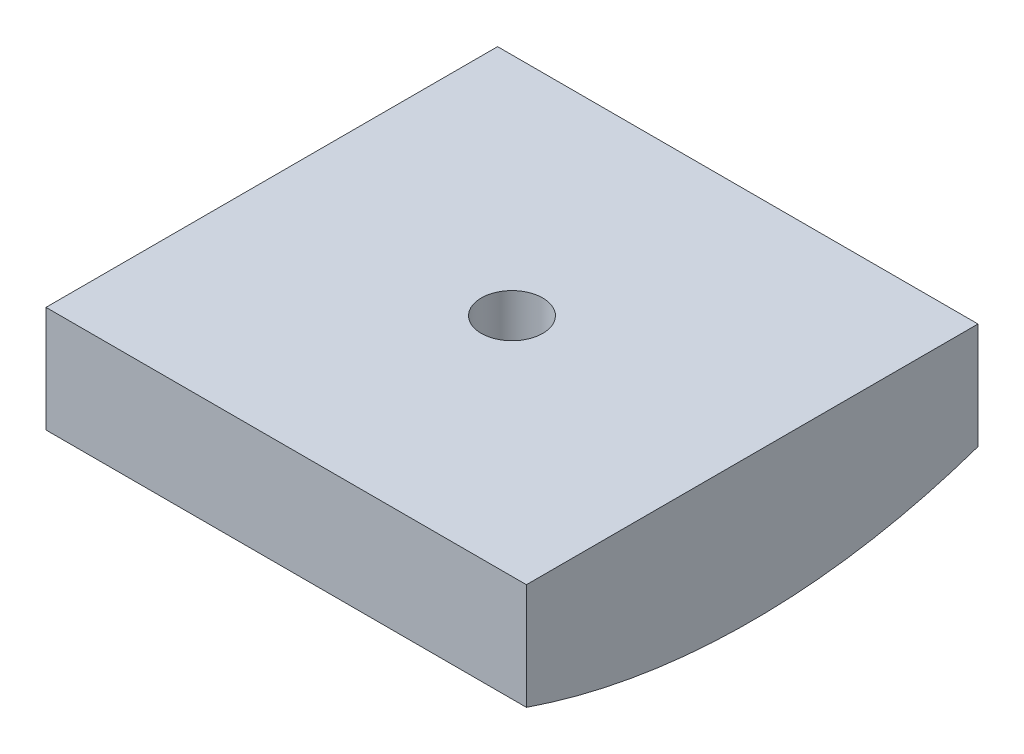
ISO-10303-21;
HEADER;
FILE_DESCRIPTION(('STEP AP214'),'2;1');
FILE_NAME('part.step','',(''),(''),'','','');
FILE_SCHEMA(('AUTOMOTIVE_DESIGN { 1 0 10303 214 1 1 1 1 }'));
ENDSEC;
DATA;
#1=APPLICATION_CONTEXT('core data for automotive mechanical design processes');
#2=APPLICATION_PROTOCOL_DEFINITION('international standard','automotive_design',2000,#1);
#3=PRODUCT_CONTEXT('',#1,'mechanical');
#4=PRODUCT('Part','Part','',(#3));
#5=PRODUCT_RELATED_PRODUCT_CATEGORY('part','',(#4));
#6=PRODUCT_DEFINITION_FORMATION('','',#4);
#7=PRODUCT_DEFINITION_CONTEXT('part definition',#1,'design');
#8=PRODUCT_DEFINITION('design','',#6,#7);
#9=PRODUCT_DEFINITION_SHAPE('','',#8);
#10=(LENGTH_UNIT() NAMED_UNIT(*) SI_UNIT(.MILLI.,.METRE.));
#11=(NAMED_UNIT(*) PLANE_ANGLE_UNIT() SI_UNIT($,.RADIAN.));
#12=(NAMED_UNIT(*) SI_UNIT($,.STERADIAN.) SOLID_ANGLE_UNIT());
#13=UNCERTAINTY_MEASURE_WITH_UNIT(LENGTH_MEASURE(1.E-05),#10,'distance_accuracy_value','');
#14=(GEOMETRIC_REPRESENTATION_CONTEXT(3) GLOBAL_UNCERTAINTY_ASSIGNED_CONTEXT((#13)) GLOBAL_UNIT_ASSIGNED_CONTEXT((#10,
#11,#12)) REPRESENTATION_CONTEXT('',''));
#15=CARTESIAN_POINT('',(0.,0.,0.));
#16=DIRECTION('',(0.,0.,1.));
#17=DIRECTION('',(1.,0.,0.));
#18=AXIS2_PLACEMENT_3D('',#15,#16,#17);
#19=CARTESIAN_POINT('',(50.,-57.,23.5));
#20=DIRECTION('',(0.,0.,-1.));
#21=DIRECTION('',(0.,1.,0.));
#22=AXIS2_PLACEMENT_3D('',#19,#20,#21);
#23=PLANE('',#22);
#24=DIRECTION('',(0.,-1.,0.));
#25=VECTOR('',#24,1.);
#26=CARTESIAN_POINT('',(0.,-57.,23.5));
#27=LINE('',#26,#25);
#28=CARTESIAN_POINT('',(0.,-57.,23.5));
#29=VERTEX_POINT('',#28);
#30=CARTESIAN_POINT('',(0.,-68.0569614367259,23.5));
#31=VERTEX_POINT('',#30);
#32=EDGE_CURVE('E108',#29,#31,#27,.T.);
#33=ORIENTED_EDGE('',*,*,#32,.T.);
#34=DIRECTION('',(-1.,0.,0.));
#35=VECTOR('',#34,1.);
#36=CARTESIAN_POINT('',(50.,-68.0569614367259,23.5));
#37=LINE('',#36,#35);
#38=CARTESIAN_POINT('',(50.,-68.0569614367259,23.5));
#39=VERTEX_POINT('',#38);
#40=EDGE_CURVE('E11',#39,#31,#37,.T.);
#41=ORIENTED_EDGE('',*,*,#40,.F.);
#42=DIRECTION('',(0.,-1.,0.));
#43=VECTOR('',#42,1.);
#44=CARTESIAN_POINT('',(50.,-57.,23.5));
#45=LINE('',#44,#43);
#46=CARTESIAN_POINT('',(50.,-57.,23.5));
#47=VERTEX_POINT('',#46);
#48=EDGE_CURVE('E95',#47,#39,#45,.T.);
#49=ORIENTED_EDGE('',*,*,#48,.F.);
#50=DIRECTION('',(-1.,0.,0.));
#51=VECTOR('',#50,1.);
#52=CARTESIAN_POINT('',(50.,-57.,23.5));
#53=LINE('',#52,#51);
#54=EDGE_CURVE('E104',#47,#29,#53,.T.);
#55=ORIENTED_EDGE('',*,*,#54,.T.);
#56=EDGE_LOOP('',(#33,#41,#49,#55));
#57=FACE_BOUND('',#56,.T.);
#58=ADVANCED_FACE('F40',(#57),#23,.F.);
#59=CARTESIAN_POINT('',(50.,0.,0.));
#60=DIRECTION('',(-1.,0.,0.));
#61=DIRECTION('',(0.,0.,1.));
#62=AXIS2_PLACEMENT_3D('',#59,#60,#61);
#63=CYLINDRICAL_SURFACE('',#62,72.);
#64=CARTESIAN_POINT('',(21.8,-72.,0.));
#65=CARTESIAN_POINT('',(21.8000079369434,-71.999999046404,0.179650240480283));
#66=CARTESIAN_POINT('',(21.8151793364166,-71.9993204155579,0.359428484415178));
#67=CARTESIAN_POINT('',(21.8754868721783,-71.9966784628278,0.71402726026861));
#68=CARTESIAN_POINT('',(21.9206584738184,-71.9947136204622,0.888841668727086));
#69=CARTESIAN_POINT('',(22.0396720936625,-71.9897216732,1.22832463753983));
#70=CARTESIAN_POINT('',(22.1134996923739,-71.986695102631,1.39299825245843));
#71=CARTESIAN_POINT('',(22.2877079292597,-71.9799207361823,1.70757006692169));
#72=CARTESIAN_POINT('',(22.3880822292757,-71.9761731125157,1.85747178162137));
#73=CARTESIAN_POINT('',(22.612628102424,-71.9683748816171,2.13841395580842));
#74=CARTESIAN_POINT('',(22.7368167696315,-71.9643240580278,2.26944074774587));
#75=CARTESIAN_POINT('',(23.005432751241,-71.9563778551614,2.50879751102607));
#76=CARTESIAN_POINT('',(23.1498608851031,-71.9524824821863,2.61712656293434));
#77=CARTESIAN_POINT('',(23.4549239483412,-71.9452849989386,2.80804753358263));
#78=CARTESIAN_POINT('',(23.615565284023,-71.9419831246188,2.89062922567701));
#79=CARTESIAN_POINT('',(23.9484495377679,-71.936347501733,3.02764554080271));
#80=CARTESIAN_POINT('',(24.120692381426,-71.9340137469588,3.08208034433179));
#81=CARTESIAN_POINT('',(24.4717685861996,-71.9305794165135,3.16122277875836));
#82=CARTESIAN_POINT('',(24.650597475121,-71.9294780194062,3.1859502121154));
#83=CARTESIAN_POINT('',(25.0098710351053,-71.9286301347246,3.20503706431197));
#84=CARTESIAN_POINT('',(25.1903156954771,-71.9288836381917,3.19939668394024));
#85=CARTESIAN_POINT('',(25.5475641460586,-71.9307162036622,3.15792455658645));
#86=CARTESIAN_POINT('',(25.724370424782,-71.932294326562,3.12211419887479));
#87=CARTESIAN_POINT('',(26.0694595127909,-71.9365967718631,3.02135177360924));
#88=CARTESIAN_POINT('',(26.2377422917002,-71.9393210983488,2.9563996022074));
#89=CARTESIAN_POINT('',(26.5610763883525,-71.9456099610856,2.79917282809279));
#90=CARTESIAN_POINT('',(26.7161229494866,-71.9491747976682,2.70688845599629));
#91=CARTESIAN_POINT('',(27.0085313552032,-71.9567425571114,2.49762403899882));
#92=CARTESIAN_POINT('',(27.1458931026288,-71.9607454823785,2.3806438584332));
#93=CARTESIAN_POINT('',(27.3991572019265,-71.968742400374,2.12518766891891));
#94=CARTESIAN_POINT('',(27.5150408664994,-71.9727363823644,1.98669313187383));
#95=CARTESIAN_POINT('',(27.7219153342698,-71.9802618853502,1.69220476712057));
#96=CARTESIAN_POINT('',(27.8129061321272,-71.9837934062464,1.53621093565846));
#97=CARTESIAN_POINT('',(27.9674100913583,-71.9899960682342,1.21114130905212));
#98=CARTESIAN_POINT('',(28.0309226215669,-71.9926671895625,1.04206521351849));
#99=CARTESIAN_POINT('',(28.1286550384668,-71.9968476959108,0.695635292903565));
#100=CARTESIAN_POINT('',(28.1628750986644,-71.9983570878121,0.518281516859521));
#101=CARTESIAN_POINT('',(28.201028205689,-72.0000431299699,0.16049293482514));
#102=CARTESIAN_POINT('',(28.2049871040846,-72.0002209177892,-0.019939109340618));
#103=CARTESIAN_POINT('',(28.1825729418848,-71.9992267316411,-0.378905044603612));
#104=CARTESIAN_POINT('',(28.1561999602021,-71.9980547611851,-0.557438940637933));
#105=CARTESIAN_POINT('',(28.0738920653307,-71.9944938190531,-0.907468345941964));
#106=CARTESIAN_POINT('',(28.0179689345176,-71.9921053324458,-1.0789666311345));
#107=CARTESIAN_POINT('',(27.8781601371625,-71.9863803452329,-1.41014203866939));
#108=CARTESIAN_POINT('',(27.7942743438199,-71.9830438403284,-1.56981910740271));
#109=CARTESIAN_POINT('',(27.6008551122941,-71.9757954919329,-1.87293824196604));
#110=CARTESIAN_POINT('',(27.4913043216078,-71.9718832598522,-2.01636922579967));
#111=CARTESIAN_POINT('',(27.2496902319763,-71.9639254514582,-2.28281332939486));
#112=CARTESIAN_POINT('',(27.1176268172148,-71.9598798744589,-2.40582634410968));
#113=CARTESIAN_POINT('',(26.8346251956215,-71.9521081460561,-2.6280294387268));
#114=CARTESIAN_POINT('',(26.6836738616543,-71.9483822198761,-2.72720280862735));
#115=CARTESIAN_POINT('',(26.3672478500014,-71.9416734592019,-2.89879725441481));
#116=CARTESIAN_POINT('',(26.2017732255844,-71.9386906219824,-2.9712184284188));
#117=CARTESIAN_POINT('',(25.8610600850239,-71.9338059895843,-3.08722351132311));
#118=CARTESIAN_POINT('',(25.6858252193025,-71.9319037931776,-3.13081812414216));
#119=CARTESIAN_POINT('',(25.330514621649,-71.9293938053216,-3.18796762374469));
#120=CARTESIAN_POINT('',(25.1504389095681,-71.9287860085652,-3.20152263369382));
#121=CARTESIAN_POINT('',(24.7907247918064,-71.9289334982036,-3.19820691635122));
#122=CARTESIAN_POINT('',(24.6110861426296,-71.9296876063865,-3.18136248824941));
#123=CARTESIAN_POINT('',(24.2571896689016,-71.9324714198217,-3.11778033924981));
#124=CARTESIAN_POINT('',(24.0829318547604,-71.9345011275418,-3.07104256052268));
#125=CARTESIAN_POINT('',(23.7447372342134,-71.939607111524,-2.94900548023359));
#126=CARTESIAN_POINT('',(23.5808005439232,-71.9426833995582,-2.87370585740981));
#127=CARTESIAN_POINT('',(23.2678958180128,-71.9495356905497,-2.69668778943174));
#128=CARTESIAN_POINT('',(23.1189272965056,-71.9533116707828,-2.59497020222483));
#129=CARTESIAN_POINT('',(22.8400577686409,-71.9611413964307,-2.36791185533253));
#130=CARTESIAN_POINT('',(22.7101712782233,-71.9651953499001,-2.24255327549538));
#131=CARTESIAN_POINT('',(22.4732479939184,-71.9731228627629,-1.97177349060203));
#132=CARTESIAN_POINT('',(22.3662168410169,-71.9769963774377,-1.82634734716413));
#133=CARTESIAN_POINT('',(22.1780029557503,-71.9841287139174,-1.51946532272718));
#134=CARTESIAN_POINT('',(22.0968424188042,-71.9873870069278,-1.35799583244203));
#135=CARTESIAN_POINT('',(21.9628793004236,-71.9929134032508,-1.02382995372562));
#136=CARTESIAN_POINT('',(21.9100431185029,-71.9951826792095,-0.851147141366025));
#137=CARTESIAN_POINT('',(21.8481345873104,-71.9978730584688,-0.56448790401563));
#138=CARTESIAN_POINT('',(21.8301070525228,-71.9986671709015,-0.452369547780284));
#139=CARTESIAN_POINT('',(21.8060372567195,-71.9997309425959,-0.226851143314235));
#140=CARTESIAN_POINT('',(21.7999949877332,-72.0000006022063,-0.113451095935954));
#141=CARTESIAN_POINT('',(21.8,-72.,0.));
#142=B_SPLINE_CURVE_WITH_KNOTS('',3,(#64,#65,#66,#67,#68,#69,#70,#71,#72,#73,#74,#75,#76,#77,
#78,#79,#80,#81,#82,#83,#84,#85,#86,#87,#88,#89,#90,#91,#92,#93,#94,#95,#96,#97,#98,#99,#100,
#101,#102,#103,#104,#105,#106,#107,#108,#109,#110,#111,#112,#113,#114,#115,#116,#117,#118,#119,
#120,#121,#122,#123,#124,#125,#126,#127,#128,#129,#130,#131,#132,#133,#134,#135,#136,#137,#138,
#139,#140,#141),.UNSPECIFIED.,.T.,.F.,(4,2,2,2,2,2,2,2,2,2,2,2,2,2,2,2,2,2,2,2,2,2,2,2,2,2,2,2,
2,2,2,2,2,2,2,2,2,2,4),(0.,0.538536591755984,1.07771096147174,1.61661437349474,2.15538923558655,
2.69455229057299,3.23373718162338,3.77313596057718,4.31253128048152,4.85156684821129,
5.39059885189999,5.9292490253836,6.46790111838253,7.00674597532472,7.5455937924493,
8.08490826289343,8.62422284903087,9.16354982235799,9.70287360109932,10.2417365936449,
10.7805981842639,11.3192450793837,11.8578944171089,12.3969090004513,12.9359263568397,
13.4753204339307,14.014712532706,14.553904231018,15.093093718581,15.6318169656232,
16.1705412548406,16.7092716037745,17.2479844591384,17.7871050214167,18.3263584920532,
18.8660733719496,19.4051465765485,19.7452385630955,20.0853303234682),.UNSPECIFIED.);
#143=CARTESIAN_POINT('',(21.8,-72.,0.));
#144=VERTEX_POINT('',#143);
#145=EDGE_CURVE('E112',#144,#144,#142,.T.);
#146=ORIENTED_EDGE('',*,*,#145,.T.);
#147=EDGE_LOOP('',(#146));
#148=FACE_BOUND('',#147,.T.);
#149=CARTESIAN_POINT('',(0.,0.,0.));
#150=DIRECTION('',(1.,0.,0.));
#151=DIRECTION('',(0.,0.,-1.));
#152=AXIS2_PLACEMENT_3D('',#149,#150,#151);
#153=CIRCLE('',#152,72.);
#154=CARTESIAN_POINT('',(0.,-68.0569614367259,-23.5));
#155=VERTEX_POINT('',#154);
#156=EDGE_CURVE('E99',#31,#155,#153,.T.);
#157=ORIENTED_EDGE('',*,*,#156,.T.);
#158=DIRECTION('',(-1.,0.,0.));
#159=VECTOR('',#158,1.);
#160=CARTESIAN_POINT('',(50.,-68.0569614367259,-23.5));
#161=LINE('',#160,#159);
#162=CARTESIAN_POINT('',(50.,-68.0569614367259,-23.5));
#163=VERTEX_POINT('',#162);
#164=EDGE_CURVE('E49',#163,#155,#161,.T.);
#165=ORIENTED_EDGE('',*,*,#164,.F.);
#166=CARTESIAN_POINT('',(50.,0.,0.));
#167=DIRECTION('',(1.,0.,0.));
#168=DIRECTION('',(0.,0.,-1.));
#169=AXIS2_PLACEMENT_3D('',#166,#167,#168);
#170=CIRCLE('',#169,72.);
#171=EDGE_CURVE('E90',#39,#163,#170,.T.);
#172=ORIENTED_EDGE('',*,*,#171,.F.);
#173=ORIENTED_EDGE('',*,*,#40,.T.);
#174=EDGE_LOOP('',(#157,#165,#172,#173));
#175=FACE_BOUND('',#174,.T.);
#176=ADVANCED_FACE('F98',(#148,#175),#63,.T.);
#177=CARTESIAN_POINT('',(50.,-57.,-23.5));
#178=DIRECTION('',(0.,0.,1.));
#179=DIRECTION('',(0.,-1.,0.));
#180=AXIS2_PLACEMENT_3D('',#177,#178,#179);
#181=PLANE('',#180);
#182=DIRECTION('',(0.,1.,0.));
#183=VECTOR('',#182,1.);
#184=CARTESIAN_POINT('',(0.,-57.,-23.5));
#185=LINE('',#184,#183);
#186=CARTESIAN_POINT('',(0.,-57.,-23.5));
#187=VERTEX_POINT('',#186);
#188=EDGE_CURVE('E76',#155,#187,#185,.T.);
#189=ORIENTED_EDGE('',*,*,#188,.T.);
#190=DIRECTION('',(-1.,0.,0.));
#191=VECTOR('',#190,1.);
#192=CARTESIAN_POINT('',(50.,-57.,-23.5));
#193=LINE('',#192,#191);
#194=CARTESIAN_POINT('',(50.,-57.,-23.5));
#195=VERTEX_POINT('',#194);
#196=EDGE_CURVE('E101',#195,#187,#193,.T.);
#197=ORIENTED_EDGE('',*,*,#196,.F.);
#198=DIRECTION('',(0.,1.,0.));
#199=VECTOR('',#198,1.);
#200=CARTESIAN_POINT('',(50.,-57.,-23.5));
#201=LINE('',#200,#199);
#202=EDGE_CURVE('E93',#163,#195,#201,.T.);
#203=ORIENTED_EDGE('',*,*,#202,.F.);
#204=ORIENTED_EDGE('',*,*,#164,.T.);
#205=EDGE_LOOP('',(#189,#197,#203,#204));
#206=FACE_BOUND('',#205,.T.);
#207=ADVANCED_FACE('F102',(#206),#181,.F.);
#208=CARTESIAN_POINT('',(50.,-57.,23.5));
#209=DIRECTION('',(0.,-1.,0.));
#210=DIRECTION('',(0.,0.,-1.));
#211=AXIS2_PLACEMENT_3D('',#208,#209,#210);
#212=PLANE('',#211);
#213=CARTESIAN_POINT('',(25.,-57.,0.));
#214=DIRECTION('',(0.,1.,0.));
#215=DIRECTION('',(0.,0.,1.));
#216=AXIS2_PLACEMENT_3D('',#213,#214,#215);
#217=CIRCLE('',#216,3.2);
#218=CARTESIAN_POINT('',(25.,-57.,3.20000000000001));
#219=VERTEX_POINT('',#218);
#220=EDGE_CURVE('E134',#219,#219,#217,.T.);
#221=ORIENTED_EDGE('',*,*,#220,.F.);
#222=EDGE_LOOP('',(#221));
#223=FACE_BOUND('',#222,.T.);
#224=DIRECTION('',(0.,0.,1.));
#225=VECTOR('',#224,1.);
#226=CARTESIAN_POINT('',(0.,-57.,23.5));
#227=LINE('',#226,#225);
#228=EDGE_CURVE('E83',#187,#29,#227,.T.);
#229=ORIENTED_EDGE('',*,*,#228,.T.);
#230=ORIENTED_EDGE('',*,*,#54,.F.);
#231=DIRECTION('',(0.,0.,1.));
#232=VECTOR('',#231,1.);
#233=CARTESIAN_POINT('',(50.,-57.,23.5));
#234=LINE('',#233,#232);
#235=EDGE_CURVE('E57',#195,#47,#234,.T.);
#236=ORIENTED_EDGE('',*,*,#235,.F.);
#237=ORIENTED_EDGE('',*,*,#196,.T.);
#238=EDGE_LOOP('',(#229,#230,#236,#237));
#239=FACE_BOUND('',#238,.T.);
#240=ADVANCED_FACE('F123',(#223,#239),#212,.F.);
#241=CARTESIAN_POINT('',(50.,0.,0.));
#242=DIRECTION('',(1.,0.,0.));
#243=DIRECTION('',(0.,0.,-1.));
#244=AXIS2_PLACEMENT_3D('',#241,#242,#243);
#245=PLANE('',#244);
#246=ORIENTED_EDGE('',*,*,#48,.T.);
#247=ORIENTED_EDGE('',*,*,#171,.T.);
#248=ORIENTED_EDGE('',*,*,#202,.T.);
#249=ORIENTED_EDGE('',*,*,#235,.T.);
#250=EDGE_LOOP('',(#246,#247,#248,#249));
#251=FACE_BOUND('',#250,.T.);
#252=ADVANCED_FACE('F91',(#251),#245,.T.);
#253=CARTESIAN_POINT('',(0.,0.,0.));
#254=DIRECTION('',(1.,0.,0.));
#255=DIRECTION('',(0.,0.,-1.));
#256=AXIS2_PLACEMENT_3D('',#253,#254,#255);
#257=PLANE('',#256);
#258=ORIENTED_EDGE('',*,*,#32,.F.);
#259=ORIENTED_EDGE('',*,*,#228,.F.);
#260=ORIENTED_EDGE('',*,*,#188,.F.);
#261=ORIENTED_EDGE('',*,*,#156,.F.);
#262=EDGE_LOOP('',(#258,#259,#260,#261));
#263=FACE_BOUND('',#262,.T.);
#264=ADVANCED_FACE('F126',(#263),#257,.F.);
#265=CARTESIAN_POINT('',(25.,-72.,0.));
#266=DIRECTION('',(0.,1.,0.));
#267=DIRECTION('',(0.,0.,1.));
#268=AXIS2_PLACEMENT_3D('',#265,#266,#267);
#269=CYLINDRICAL_SURFACE('',#268,3.2);
#270=ORIENTED_EDGE('',*,*,#220,.T.);
#271=EDGE_LOOP('',(#270));
#272=FACE_BOUND('',#271,.T.);
#273=ORIENTED_EDGE('',*,*,#145,.F.);
#274=EDGE_LOOP('',(#273));
#275=FACE_BOUND('',#274,.T.);
#276=ADVANCED_FACE('F137',(#272,#275),#269,.F.);
#277=CLOSED_SHELL('',(#58,#176,#207,#240,#252,#264,#276));
#278=MANIFOLD_SOLID_BREP('B2',#277);
#279=ADVANCED_BREP_SHAPE_REPRESENTATION('',(#18,#278),#14);
#280=SHAPE_DEFINITION_REPRESENTATION(#9,#279);
ENDSEC;
END-ISO-10303-21;
